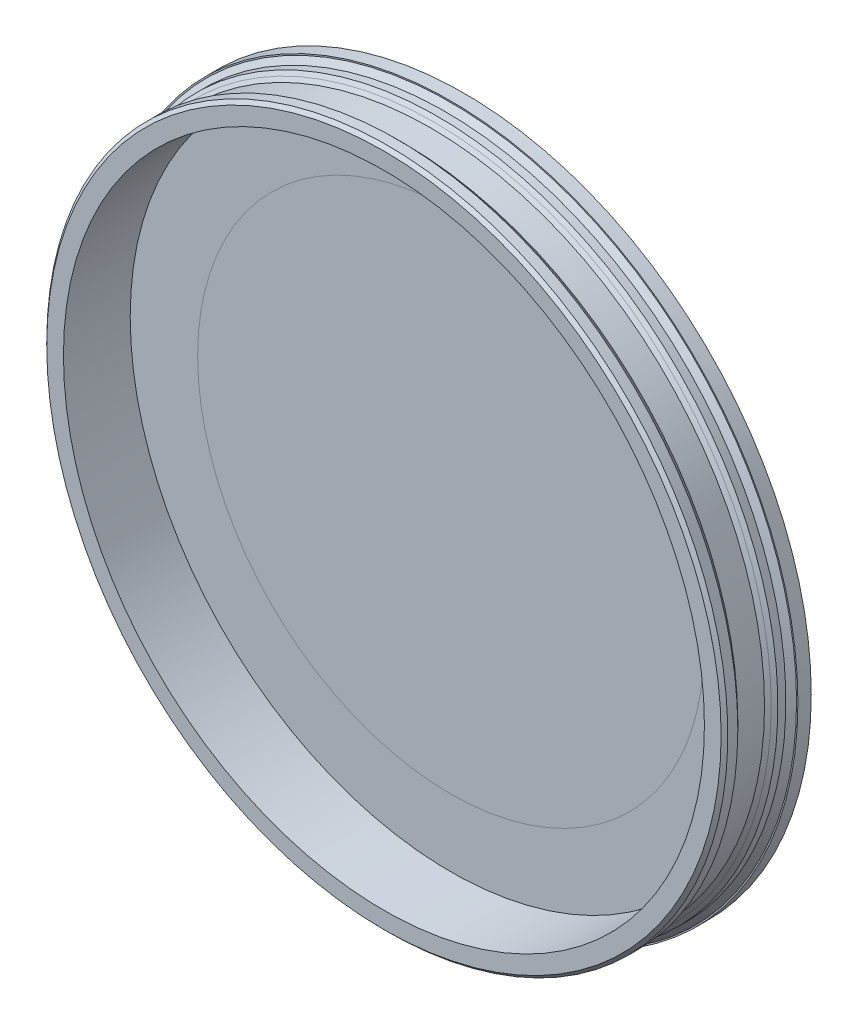
ISO-10303-21;
HEADER;
FILE_DESCRIPTION(('STEP AP214'),'2;1');
FILE_NAME('part.step','',(''),(''),'','','');
FILE_SCHEMA(('AUTOMOTIVE_DESIGN { 1 0 10303 214 1 1 1 1 }'));
ENDSEC;
DATA;
#1=APPLICATION_CONTEXT('core data for automotive mechanical design processes');
#2=APPLICATION_PROTOCOL_DEFINITION('international standard','automotive_design',2000,#1);
#3=PRODUCT_CONTEXT('',#1,'mechanical');
#4=PRODUCT('Part','Part','',(#3));
#5=PRODUCT_RELATED_PRODUCT_CATEGORY('part','',(#4));
#6=PRODUCT_DEFINITION_FORMATION('','',#4);
#7=PRODUCT_DEFINITION_CONTEXT('part definition',#1,'design');
#8=PRODUCT_DEFINITION('design','',#6,#7);
#9=PRODUCT_DEFINITION_SHAPE('','',#8);
#10=(LENGTH_UNIT() NAMED_UNIT(*) SI_UNIT(.MILLI.,.METRE.));
#11=(NAMED_UNIT(*) PLANE_ANGLE_UNIT() SI_UNIT($,.RADIAN.));
#12=(NAMED_UNIT(*) SI_UNIT($,.STERADIAN.) SOLID_ANGLE_UNIT());
#13=UNCERTAINTY_MEASURE_WITH_UNIT(LENGTH_MEASURE(1.E-05),#10,'distance_accuracy_value','');
#14=(GEOMETRIC_REPRESENTATION_CONTEXT(3) GLOBAL_UNCERTAINTY_ASSIGNED_CONTEXT((#13)) GLOBAL_UNIT_ASSIGNED_CONTEXT((#10,
#11,#12)) REPRESENTATION_CONTEXT('',''));
#15=CARTESIAN_POINT('',(0.,0.,0.));
#16=DIRECTION('',(0.,0.,1.));
#17=DIRECTION('',(1.,0.,0.));
#18=AXIS2_PLACEMENT_3D('',#15,#16,#17);
#19=CARTESIAN_POINT('',(0.,0.,8.7));
#20=DIRECTION('',(0.,0.,-1.));
#21=DIRECTION('',(-1.,0.,0.));
#22=AXIS2_PLACEMENT_3D('',#19,#20,#21);
#23=CYLINDRICAL_SURFACE('',#22,37.9);
#24=CARTESIAN_POINT('',(0.,0.,8.7));
#25=DIRECTION('',(0.,0.,-1.));
#26=DIRECTION('',(-1.,0.,0.));
#27=AXIS2_PLACEMENT_3D('',#24,#25,#26);
#28=CIRCLE('',#27,37.9);
#29=CARTESIAN_POINT('',(-37.9,0.,8.7));
#30=VERTEX_POINT('',#29);
#31=EDGE_CURVE('E11',#30,#30,#28,.T.);
#32=ORIENTED_EDGE('',*,*,#31,.T.);
#33=EDGE_LOOP('',(#32));
#34=FACE_BOUND('',#33,.T.);
#35=CARTESIAN_POINT('',(0.,0.,6.7));
#36=DIRECTION('',(0.,0.,-1.));
#37=DIRECTION('',(-1.,0.,0.));
#38=AXIS2_PLACEMENT_3D('',#35,#36,#37);
#39=CIRCLE('',#38,37.9);
#40=CARTESIAN_POINT('',(-37.9,0.,6.7));
#41=VERTEX_POINT('',#40);
#42=EDGE_CURVE('E48',#41,#41,#39,.T.);
#43=ORIENTED_EDGE('',*,*,#42,.F.);
#44=EDGE_LOOP('',(#43));
#45=FACE_BOUND('',#44,.T.);
#46=ADVANCED_FACE('F45',(#34,#45),#23,.T.);
#47=CARTESIAN_POINT('',(0.,0.,8.7));
#48=DIRECTION('',(0.,0.,-1.));
#49=DIRECTION('',(-1.,0.,0.));
#50=AXIS2_PLACEMENT_3D('',#47,#48,#49);
#51=PLANE('',#50);
#52=ORIENTED_EDGE('',*,*,#31,.F.);
#53=EDGE_LOOP('',(#52));
#54=FACE_BOUND('',#53,.T.);
#55=ADVANCED_FACE('F60',(#54),#51,.F.);
#56=CARTESIAN_POINT('',(0.,0.,6.7));
#57=DIRECTION('',(0.,0.,-1.));
#58=DIRECTION('',(-1.,0.,0.));
#59=AXIS2_PLACEMENT_3D('',#56,#57,#58);
#60=PLANE('',#59);
#61=ORIENTED_EDGE('',*,*,#42,.T.);
#62=EDGE_LOOP('',(#61));
#63=FACE_BOUND('',#62,.T.);
#64=ADVANCED_FACE('F57',(#63),#60,.T.);
#65=CLOSED_SHELL('',(#46,#55,#64));
#66=MANIFOLD_SOLID_BREP('B2',#65);
#67=CARTESIAN_POINT('',(0.,0.,-73.9813673678491));
#68=DIRECTION('',(0.,0.,-1.));
#69=DIRECTION('',(-1.,0.,0.));
#70=AXIS2_PLACEMENT_3D('',#67,#68,#69);
#71=CYLINDRICAL_SURFACE('',#70,37.9);
#72=CARTESIAN_POINT('',(0.,0.,6.7));
#73=DIRECTION('',(0.,0.,1.));
#74=DIRECTION('',(1.,0.,0.));
#75=AXIS2_PLACEMENT_3D('',#72,#73,#74);
#76=CIRCLE('',#75,37.9);
#77=CARTESIAN_POINT('',(37.9,0.,6.7));
#78=VERTEX_POINT('',#77);
#79=EDGE_CURVE('E112',#78,#78,#76,.F.);
#80=ORIENTED_EDGE('',*,*,#79,.T.);
#81=EDGE_LOOP('',(#80));
#82=FACE_BOUND('',#81,.T.);
#83=CARTESIAN_POINT('',(0.,0.,8.7));
#84=DIRECTION('',(0.,0.,-1.));
#85=DIRECTION('',(-1.,0.,0.));
#86=AXIS2_PLACEMENT_3D('',#83,#84,#85);
#87=CIRCLE('',#86,37.9);
#88=CARTESIAN_POINT('',(-37.9,0.,8.7));
#89=VERTEX_POINT('',#88);
#90=EDGE_CURVE('E136',#89,#89,#87,.T.);
#91=ORIENTED_EDGE('',*,*,#90,.F.);
#92=EDGE_LOOP('',(#91));
#93=FACE_BOUND('',#92,.T.);
#94=ADVANCED_FACE('F86',(#82,#93),#71,.F.);
#95=CARTESIAN_POINT('',(37.9,0.,8.7));
#96=DIRECTION('',(0.,0.,-1.));
#97=DIRECTION('',(-1.,0.,0.));
#98=AXIS2_PLACEMENT_3D('',#95,#96,#97);
#99=PLANE('',#98);
#100=CARTESIAN_POINT('',(0.,0.,8.7));
#101=DIRECTION('',(0.,0.,-1.));
#102=DIRECTION('',(-1.,0.,0.));
#103=AXIS2_PLACEMENT_3D('',#100,#101,#102);
#104=CIRCLE('',#103,48.);
#105=CARTESIAN_POINT('',(-48.,0.,8.7));
#106=VERTEX_POINT('',#105);
#107=EDGE_CURVE('E140',#106,#106,#104,.T.);
#108=ORIENTED_EDGE('',*,*,#107,.F.);
#109=EDGE_LOOP('',(#108));
#110=FACE_BOUND('',#109,.T.);
#111=ORIENTED_EDGE('',*,*,#90,.T.);
#112=EDGE_LOOP('',(#111));
#113=FACE_BOUND('',#112,.T.);
#114=ADVANCED_FACE('F179',(#110,#113),#99,.F.);
#115=CARTESIAN_POINT('',(0.,0.,-73.9813673678491));
#116=DIRECTION('',(0.,0.,-1.));
#117=DIRECTION('',(-1.,0.,0.));
#118=AXIS2_PLACEMENT_3D('',#115,#116,#117);
#119=CYLINDRICAL_SURFACE('',#118,48.);
#120=CARTESIAN_POINT('',(0.,0.,18.7));
#121=DIRECTION('',(0.,0.,-1.));
#122=DIRECTION('',(-1.,0.,0.));
#123=AXIS2_PLACEMENT_3D('',#120,#121,#122);
#124=CIRCLE('',#123,48.);
#125=CARTESIAN_POINT('',(-48.,0.,18.7));
#126=VERTEX_POINT('',#125);
#127=EDGE_CURVE('E144',#126,#126,#124,.T.);
#128=ORIENTED_EDGE('',*,*,#127,.F.);
#129=EDGE_LOOP('',(#128));
#130=FACE_BOUND('',#129,.T.);
#131=ORIENTED_EDGE('',*,*,#107,.T.);
#132=EDGE_LOOP('',(#131));
#133=FACE_BOUND('',#132,.T.);
#134=ADVANCED_FACE('F185',(#130,#133),#119,.F.);
#135=CARTESIAN_POINT('',(48.,0.,18.7));
#136=DIRECTION('',(0.,0.,-1.));
#137=DIRECTION('',(-1.,0.,0.));
#138=AXIS2_PLACEMENT_3D('',#135,#136,#137);
#139=PLANE('',#138);
#140=CARTESIAN_POINT('',(0.,0.,18.7));
#141=DIRECTION('',(0.,0.,-1.));
#142=DIRECTION('',(-1.,0.,0.));
#143=AXIS2_PLACEMENT_3D('',#140,#141,#142);
#144=CIRCLE('',#143,50.5);
#145=CARTESIAN_POINT('',(-50.5,0.,18.7));
#146=VERTEX_POINT('',#145);
#147=EDGE_CURVE('E124',#146,#146,#144,.F.);
#148=ORIENTED_EDGE('',*,*,#147,.T.);
#149=EDGE_LOOP('',(#148));
#150=FACE_BOUND('',#149,.T.);
#151=ORIENTED_EDGE('',*,*,#127,.T.);
#152=EDGE_LOOP('',(#151));
#153=FACE_BOUND('',#152,.T.);
#154=ADVANCED_FACE('F222',(#150,#153),#139,.F.);
#155=CARTESIAN_POINT('',(0.,0.,-73.9813673678491));
#156=DIRECTION('',(0.,0.,-1.));
#157=DIRECTION('',(-1.,0.,0.));
#158=AXIS2_PLACEMENT_3D('',#155,#156,#157);
#159=CYLINDRICAL_SURFACE('',#158,51.);
#160=CARTESIAN_POINT('',(0.,0.,18.2));
#161=DIRECTION('',(0.,0.,-1.));
#162=DIRECTION('',(-1.,0.,0.));
#163=AXIS2_PLACEMENT_3D('',#160,#161,#162);
#164=CIRCLE('',#163,51.);
#165=CARTESIAN_POINT('',(-51.,0.,18.2));
#166=VERTEX_POINT('',#165);
#167=EDGE_CURVE('E128',#166,#166,#164,.T.);
#168=ORIENTED_EDGE('',*,*,#167,.T.);
#169=EDGE_LOOP('',(#168));
#170=FACE_BOUND('',#169,.T.);
#171=CARTESIAN_POINT('',(0.,0.,16.7));
#172=DIRECTION('',(0.,0.,1.));
#173=DIRECTION('',(1.,0.,0.));
#174=AXIS2_PLACEMENT_3D('',#171,#172,#173);
#175=CIRCLE('',#174,51.);
#176=CARTESIAN_POINT('',(51.,0.,16.7));
#177=VERTEX_POINT('',#176);
#178=EDGE_CURVE('E132',#177,#177,#175,.T.);
#179=ORIENTED_EDGE('',*,*,#178,.T.);
#180=EDGE_LOOP('',(#179));
#181=FACE_BOUND('',#180,.T.);
#182=ADVANCED_FACE('F214',(#170,#181),#159,.T.);
#183=CARTESIAN_POINT('',(0.,0.,-73.9813673678491));
#184=DIRECTION('',(0.,0.,-1.));
#185=DIRECTION('',(-1.,0.,0.));
#186=AXIS2_PLACEMENT_3D('',#183,#184,#185);
#187=CYLINDRICAL_SURFACE('',#186,50.);
#188=CARTESIAN_POINT('',(0.,0.,11.7));
#189=DIRECTION('',(0.,0.,-1.));
#190=DIRECTION('',(-1.,0.,0.));
#191=AXIS2_PLACEMENT_3D('',#188,#189,#190);
#192=CIRCLE('',#191,50.);
#193=CARTESIAN_POINT('',(-50.,0.,11.7));
#194=VERTEX_POINT('',#193);
#195=EDGE_CURVE('E99',#194,#194,#192,.F.);
#196=ORIENTED_EDGE('',*,*,#195,.T.);
#197=EDGE_LOOP('',(#196));
#198=FACE_BOUND('',#197,.T.);
#199=CARTESIAN_POINT('',(0.,0.,15.7));
#200=DIRECTION('',(0.,0.,1.));
#201=DIRECTION('',(1.,0.,0.));
#202=AXIS2_PLACEMENT_3D('',#199,#200,#201);
#203=CIRCLE('',#202,50.);
#204=CARTESIAN_POINT('',(50.,0.,15.7));
#205=VERTEX_POINT('',#204);
#206=EDGE_CURVE('E104',#205,#205,#203,.F.);
#207=ORIENTED_EDGE('',*,*,#206,.T.);
#208=EDGE_LOOP('',(#207));
#209=FACE_BOUND('',#208,.T.);
#210=ADVANCED_FACE('F211',(#198,#209),#187,.T.);
#211=CARTESIAN_POINT('',(0.,0.,-73.9813673678491));
#212=DIRECTION('',(0.,0.,-1.));
#213=DIRECTION('',(-1.,0.,0.));
#214=AXIS2_PLACEMENT_3D('',#211,#212,#213);
#215=CYLINDRICAL_SURFACE('',#214,51.);
#216=CARTESIAN_POINT('',(0.,0.,9.49999999999998));
#217=DIRECTION('',(0.,0.,-1.));
#218=DIRECTION('',(-1.,0.,0.));
#219=AXIS2_PLACEMENT_3D('',#216,#217,#218);
#220=CIRCLE('',#219,51.);
#221=CARTESIAN_POINT('',(-51.,0.,9.49999999999998));
#222=VERTEX_POINT('',#221);
#223=EDGE_CURVE('E44',#222,#222,#220,.F.);
#224=ORIENTED_EDGE('',*,*,#223,.T.);
#225=EDGE_LOOP('',(#224));
#226=FACE_BOUND('',#225,.T.);
#227=CARTESIAN_POINT('',(0.,0.,10.7));
#228=DIRECTION('',(0.,0.,-1.));
#229=DIRECTION('',(-1.,0.,0.));
#230=AXIS2_PLACEMENT_3D('',#227,#228,#229);
#231=CIRCLE('',#230,51.);
#232=CARTESIAN_POINT('',(-51.,0.,10.7));
#233=VERTEX_POINT('',#232);
#234=EDGE_CURVE('E120',#233,#233,#231,.T.);
#235=ORIENTED_EDGE('',*,*,#234,.T.);
#236=EDGE_LOOP('',(#235));
#237=FACE_BOUND('',#236,.T.);
#238=ADVANCED_FACE('F213',(#226,#237),#215,.T.);
#239=CARTESIAN_POINT('',(51.,0.,8.7));
#240=DIRECTION('',(0.,0.,-1.));
#241=DIRECTION('',(-1.,0.,0.));
#242=AXIS2_PLACEMENT_3D('',#239,#240,#241);
#243=PLANE('',#242);
#244=CARTESIAN_POINT('',(0.,0.,8.7));
#245=DIRECTION('',(0.,0.,-1.));
#246=DIRECTION('',(-1.,0.,0.));
#247=AXIS2_PLACEMENT_3D('',#244,#245,#246);
#248=CIRCLE('',#247,51.8);
#249=CARTESIAN_POINT('',(-51.8,0.,8.7));
#250=VERTEX_POINT('',#249);
#251=EDGE_CURVE('E94',#250,#250,#248,.T.);
#252=ORIENTED_EDGE('',*,*,#251,.T.);
#253=EDGE_LOOP('',(#252));
#254=FACE_BOUND('',#253,.T.);
#255=CARTESIAN_POINT('',(0.,0.,8.7));
#256=DIRECTION('',(0.,0.,-1.));
#257=DIRECTION('',(-1.,0.,0.));
#258=AXIS2_PLACEMENT_3D('',#255,#256,#257);
#259=CIRCLE('',#258,52.);
#260=CARTESIAN_POINT('',(-52.,0.,8.7));
#261=VERTEX_POINT('',#260);
#262=EDGE_CURVE('E148',#261,#261,#259,.T.);
#263=ORIENTED_EDGE('',*,*,#262,.F.);
#264=EDGE_LOOP('',(#263));
#265=FACE_BOUND('',#264,.T.);
#266=ADVANCED_FACE('F175',(#254,#265),#243,.F.);
#267=CARTESIAN_POINT('',(0.,0.,-73.9813673678491));
#268=DIRECTION('',(0.,0.,-1.));
#269=DIRECTION('',(-1.,0.,0.));
#270=AXIS2_PLACEMENT_3D('',#267,#268,#269);
#271=CYLINDRICAL_SURFACE('',#270,52.);
#272=CARTESIAN_POINT('',(0.,0.,6.7));
#273=DIRECTION('',(0.,0.,-1.));
#274=DIRECTION('',(-1.,0.,0.));
#275=AXIS2_PLACEMENT_3D('',#272,#273,#274);
#276=CIRCLE('',#275,52.);
#277=CARTESIAN_POINT('',(-52.,0.,6.7));
#278=VERTEX_POINT('',#277);
#279=EDGE_CURVE('E115',#278,#278,#276,.T.);
#280=ORIENTED_EDGE('',*,*,#279,.F.);
#281=EDGE_LOOP('',(#280));
#282=FACE_BOUND('',#281,.T.);
#283=ORIENTED_EDGE('',*,*,#262,.T.);
#284=EDGE_LOOP('',(#283));
#285=FACE_BOUND('',#284,.T.);
#286=ADVANCED_FACE('F164',(#282,#285),#271,.T.);
#287=CARTESIAN_POINT('',(52.,0.,6.7));
#288=DIRECTION('',(0.,0.,1.));
#289=DIRECTION('',(1.,0.,0.));
#290=AXIS2_PLACEMENT_3D('',#287,#288,#289);
#291=PLANE('',#290);
#292=ORIENTED_EDGE('',*,*,#279,.T.);
#293=EDGE_LOOP('',(#292));
#294=FACE_BOUND('',#293,.T.);
#295=ORIENTED_EDGE('',*,*,#79,.F.);
#296=EDGE_LOOP('',(#295));
#297=FACE_BOUND('',#296,.T.);
#298=ADVANCED_FACE('F161',(#294,#297),#291,.F.);
#299=CARTESIAN_POINT('',(0.,0.,18.2));
#300=DIRECTION('',(0.,0.,-1.));
#301=DIRECTION('',(-1.,0.,0.));
#302=AXIS2_PLACEMENT_3D('',#299,#300,#301);
#303=CONICAL_SURFACE('',#302,51.,0.785398163397469);
#304=ORIENTED_EDGE('',*,*,#147,.F.);
#305=EDGE_LOOP('',(#304));
#306=FACE_BOUND('',#305,.T.);
#307=ORIENTED_EDGE('',*,*,#167,.F.);
#308=EDGE_LOOP('',(#307));
#309=FACE_BOUND('',#308,.T.);
#310=ADVANCED_FACE('F163',(#306,#309),#303,.T.);
#311=CARTESIAN_POINT('',(0.,0.,11.2));
#312=DIRECTION('',(0.,0.,-1.));
#313=DIRECTION('',(-1.,0.,0.));
#314=AXIS2_PLACEMENT_3D('',#311,#312,#313);
#315=CONICAL_SURFACE('',#314,50.5,0.785398163397448);
#316=ORIENTED_EDGE('',*,*,#195,.F.);
#317=EDGE_LOOP('',(#316));
#318=FACE_BOUND('',#317,.T.);
#319=CARTESIAN_POINT('',(0.,0.,11.2));
#320=DIRECTION('',(0.,0.,-1.));
#321=DIRECTION('',(-1.,0.,0.));
#322=AXIS2_PLACEMENT_3D('',#319,#320,#321);
#323=CIRCLE('',#322,50.5);
#324=CARTESIAN_POINT('',(-50.5,0.,11.2));
#325=VERTEX_POINT('',#324);
#326=EDGE_CURVE('E111',#325,#325,#323,.T.);
#327=ORIENTED_EDGE('',*,*,#326,.F.);
#328=EDGE_LOOP('',(#327));
#329=FACE_BOUND('',#328,.T.);
#330=ADVANCED_FACE('F171',(#318,#329),#315,.T.);
#331=CARTESIAN_POINT('',(0.,0.,10.7));
#332=DIRECTION('',(0.,0.,-1.));
#333=DIRECTION('',(-1.,0.,0.));
#334=AXIS2_PLACEMENT_3D('',#331,#332,#333);
#335=CONICAL_SURFACE('',#334,51.,0.785398163397455);
#336=ORIENTED_EDGE('',*,*,#326,.T.);
#337=EDGE_LOOP('',(#336));
#338=FACE_BOUND('',#337,.T.);
#339=ORIENTED_EDGE('',*,*,#234,.F.);
#340=EDGE_LOOP('',(#339));
#341=FACE_BOUND('',#340,.T.);
#342=ADVANCED_FACE('F190',(#338,#341),#335,.T.);
#343=CARTESIAN_POINT('',(0.,0.,16.2));
#344=DIRECTION('',(0.,0.,1.));
#345=DIRECTION('',(1.,0.,0.));
#346=AXIS2_PLACEMENT_3D('',#343,#344,#345);
#347=CONICAL_SURFACE('',#346,50.5,0.785398163397428);
#348=ORIENTED_EDGE('',*,*,#178,.F.);
#349=EDGE_LOOP('',(#348));
#350=FACE_BOUND('',#349,.T.);
#351=CARTESIAN_POINT('',(0.,0.,16.2));
#352=DIRECTION('',(0.,0.,1.));
#353=DIRECTION('',(1.,0.,0.));
#354=AXIS2_PLACEMENT_3D('',#351,#352,#353);
#355=CIRCLE('',#354,50.5);
#356=CARTESIAN_POINT('',(50.5,0.,16.2));
#357=VERTEX_POINT('',#356);
#358=EDGE_CURVE('E107',#357,#357,#355,.F.);
#359=ORIENTED_EDGE('',*,*,#358,.F.);
#360=EDGE_LOOP('',(#359));
#361=FACE_BOUND('',#360,.T.);
#362=ADVANCED_FACE('F193',(#350,#361),#347,.T.);
#363=CARTESIAN_POINT('',(0.,0.,15.7));
#364=DIRECTION('',(0.,0.,1.));
#365=DIRECTION('',(1.,0.,0.));
#366=AXIS2_PLACEMENT_3D('',#363,#364,#365);
#367=CONICAL_SURFACE('',#366,50.,0.785398163397448);
#368=ORIENTED_EDGE('',*,*,#358,.T.);
#369=EDGE_LOOP('',(#368));
#370=FACE_BOUND('',#369,.T.);
#371=ORIENTED_EDGE('',*,*,#206,.F.);
#372=EDGE_LOOP('',(#371));
#373=FACE_BOUND('',#372,.T.);
#374=ADVANCED_FACE('F198',(#370,#373),#367,.T.);
#375=CARTESIAN_POINT('',(0.,0.,8.7));
#376=DIRECTION('',(0.,0.,-1.));
#377=DIRECTION('',(-1.,0.,0.));
#378=AXIS2_PLACEMENT_3D('',#375,#376,#377);
#379=CONICAL_SURFACE('',#378,51.8,0.785398163397453);
#380=ORIENTED_EDGE('',*,*,#223,.F.);
#381=EDGE_LOOP('',(#380));
#382=FACE_BOUND('',#381,.T.);
#383=ORIENTED_EDGE('',*,*,#251,.F.);
#384=EDGE_LOOP('',(#383));
#385=FACE_BOUND('',#384,.T.);
#386=ADVANCED_FACE('F88',(#382,#385),#379,.T.);
#387=CLOSED_SHELL('',(#94,#114,#134,#154,#182,#210,#238,#266,#286,#298,#310,#330,#342,#362,#374,#386));
#388=MANIFOLD_SOLID_BREP('B6',#387);
#389=ADVANCED_BREP_SHAPE_REPRESENTATION('',(#18,#66,#388),#14);
#390=SHAPE_DEFINITION_REPRESENTATION(#9,#389);
ENDSEC;
END-ISO-10303-21;
